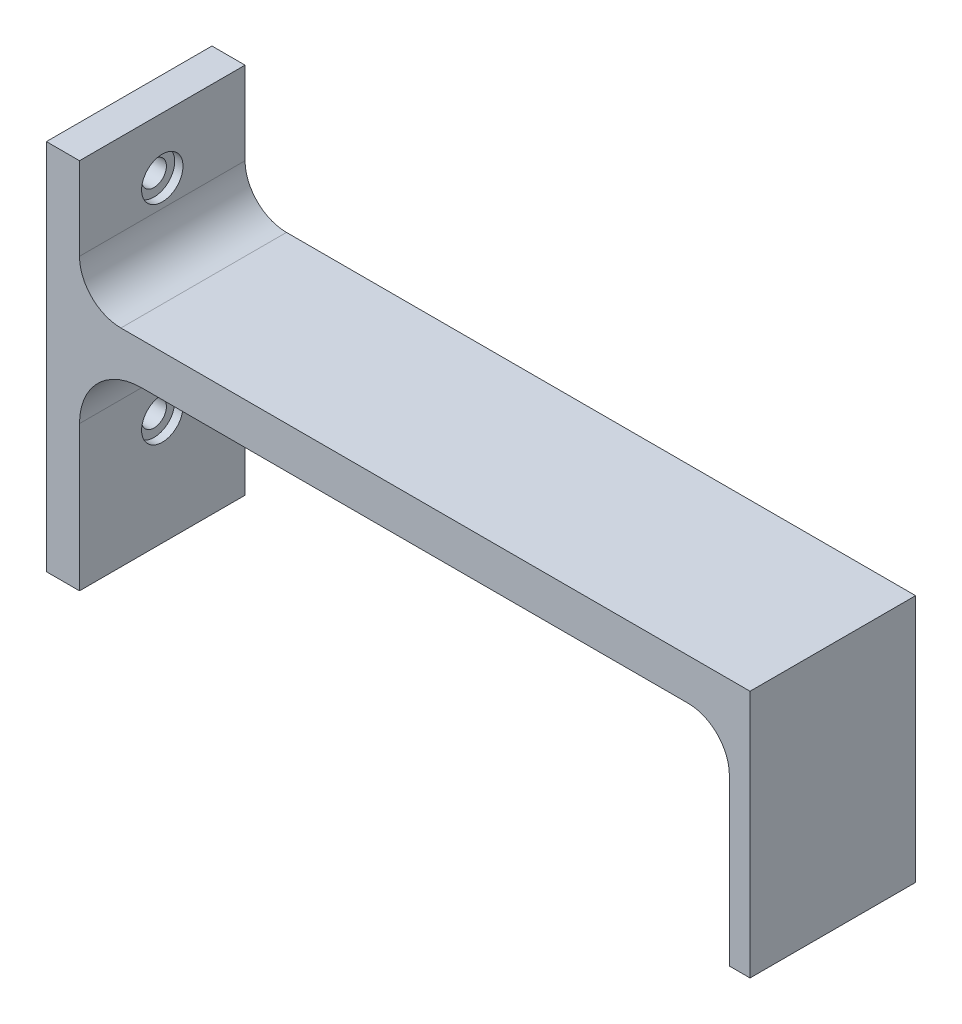
ISO-10303-21;
HEADER;
FILE_DESCRIPTION(('STEP AP214'),'2;1');
FILE_NAME('part.step','',(''),(''),'','','');
FILE_SCHEMA(('AUTOMOTIVE_DESIGN { 1 0 10303 214 1 1 1 1 }'));
ENDSEC;
DATA;
#1=APPLICATION_CONTEXT('core data for automotive mechanical design processes');
#2=APPLICATION_PROTOCOL_DEFINITION('international standard','automotive_design',2000,#1);
#3=PRODUCT_CONTEXT('',#1,'mechanical');
#4=PRODUCT('Part','Part','',(#3));
#5=PRODUCT_RELATED_PRODUCT_CATEGORY('part','',(#4));
#6=PRODUCT_DEFINITION_FORMATION('','',#4);
#7=PRODUCT_DEFINITION_CONTEXT('part definition',#1,'design');
#8=PRODUCT_DEFINITION('design','',#6,#7);
#9=PRODUCT_DEFINITION_SHAPE('','',#8);
#10=(LENGTH_UNIT() NAMED_UNIT(*) SI_UNIT(.MILLI.,.METRE.));
#11=(NAMED_UNIT(*) PLANE_ANGLE_UNIT() SI_UNIT($,.RADIAN.));
#12=(NAMED_UNIT(*) SI_UNIT($,.STERADIAN.) SOLID_ANGLE_UNIT());
#13=UNCERTAINTY_MEASURE_WITH_UNIT(LENGTH_MEASURE(1.E-05),#10,'distance_accuracy_value','');
#14=(GEOMETRIC_REPRESENTATION_CONTEXT(3) GLOBAL_UNCERTAINTY_ASSIGNED_CONTEXT((#13)) GLOBAL_UNIT_ASSIGNED_CONTEXT((#10,
#11,#12)) REPRESENTATION_CONTEXT('',''));
#15=CARTESIAN_POINT('',(0.,0.,0.));
#16=DIRECTION('',(0.,0.,1.));
#17=DIRECTION('',(1.,0.,0.));
#18=AXIS2_PLACEMENT_3D('',#15,#16,#17);
#19=CARTESIAN_POINT('',(85.001,26.3865645898633,0.));
#20=DIRECTION('',(-1.,0.,0.));
#21=DIRECTION('',(0.,0.,1.));
#22=AXIS2_PLACEMENT_3D('',#19,#20,#21);
#23=CYLINDRICAL_SURFACE('',#22,3.);
#24=CARTESIAN_POINT('',(-85.,26.3865645898633,0.));
#25=DIRECTION('',(-1.,0.,0.));
#26=DIRECTION('',(0.,0.,1.));
#27=AXIS2_PLACEMENT_3D('',#24,#25,#26);
#28=CIRCLE('',#27,3.);
#29=CARTESIAN_POINT('',(-85.,26.3865645898633,3.));
#30=VERTEX_POINT('',#29);
#31=EDGE_CURVE('E154',#30,#30,#28,.T.);
#32=ORIENTED_EDGE('',*,*,#31,.T.);
#33=EDGE_LOOP('',(#32));
#34=FACE_BOUND('',#33,.T.);
#35=CARTESIAN_POINT('',(-79.,26.3865645898633,0.));
#36=DIRECTION('',(1.,0.,0.));
#37=DIRECTION('',(0.,0.,-1.));
#38=AXIS2_PLACEMENT_3D('',#35,#36,#37);
#39=CIRCLE('',#38,3.);
#40=CARTESIAN_POINT('',(-79.,26.3865645898633,-3.));
#41=VERTEX_POINT('',#40);
#42=EDGE_CURVE('E37',#41,#41,#39,.F.);
#43=ORIENTED_EDGE('',*,*,#42,.F.);
#44=EDGE_LOOP('',(#43));
#45=FACE_BOUND('',#44,.T.);
#46=ADVANCED_FACE('F33',(#34,#45),#23,.F.);
#47=CARTESIAN_POINT('',(85.001,-23.9076754085978,0.));
#48=DIRECTION('',(-1.,0.,0.));
#49=DIRECTION('',(0.,0.,1.));
#50=AXIS2_PLACEMENT_3D('',#47,#48,#49);
#51=CYLINDRICAL_SURFACE('',#50,3.);
#52=CARTESIAN_POINT('',(-85.,-23.9076754085978,0.));
#53=DIRECTION('',(-1.,0.,0.));
#54=DIRECTION('',(0.,0.,1.));
#55=AXIS2_PLACEMENT_3D('',#52,#53,#54);
#56=CIRCLE('',#55,3.);
#57=CARTESIAN_POINT('',(-85.,-23.9076754085978,3.));
#58=VERTEX_POINT('',#57);
#59=EDGE_CURVE('E157',#58,#58,#56,.T.);
#60=ORIENTED_EDGE('',*,*,#59,.T.);
#61=EDGE_LOOP('',(#60));
#62=FACE_BOUND('',#61,.T.);
#63=CARTESIAN_POINT('',(-79.,-23.9076754085978,0.));
#64=DIRECTION('',(1.,0.,0.));
#65=DIRECTION('',(0.,0.,-1.));
#66=AXIS2_PLACEMENT_3D('',#63,#64,#65);
#67=CIRCLE('',#66,3.);
#68=CARTESIAN_POINT('',(-79.,-23.9076754085978,-3.));
#69=VERTEX_POINT('',#68);
#70=EDGE_CURVE('E234',#69,#69,#67,.F.);
#71=ORIENTED_EDGE('',*,*,#70,.F.);
#72=EDGE_LOOP('',(#71));
#73=FACE_BOUND('',#72,.T.);
#74=ADVANCED_FACE('F261',(#62,#73),#51,.F.);
#75=CARTESIAN_POINT('',(0.,0.,0.));
#76=DIRECTION('',(0.,1.,0.));
#77=DIRECTION('',(0.,0.,1.));
#78=AXIS2_PLACEMENT_3D('',#75,#76,#77);
#79=PLANE('',#78);
#80=DIRECTION('',(-1.,0.,0.));
#81=VECTOR('',#80,1.);
#82=CARTESIAN_POINT('',(-85.,0.,-20.));
#83=LINE('',#82,#81);
#84=CARTESIAN_POINT('',(70.,0.,-20.));
#85=VERTEX_POINT('',#84);
#86=CARTESIAN_POINT('',(-62.,0.,-20.));
#87=VERTEX_POINT('',#86);
#88=EDGE_CURVE('E195',#85,#87,#83,.T.);
#89=ORIENTED_EDGE('',*,*,#88,.F.);
#90=DIRECTION('',(0.,0.,-1.));
#91=VECTOR('',#90,1.);
#92=CARTESIAN_POINT('',(70.,0.,20.));
#93=LINE('',#92,#91);
#94=CARTESIAN_POINT('',(70.,0.,20.));
#95=VERTEX_POINT('',#94);
#96=EDGE_CURVE('E224',#85,#95,#93,.F.);
#97=ORIENTED_EDGE('',*,*,#96,.T.);
#98=DIRECTION('',(1.,0.,0.));
#99=VECTOR('',#98,1.);
#100=CARTESIAN_POINT('',(-85.,0.,20.));
#101=LINE('',#100,#99);
#102=CARTESIAN_POINT('',(-62.,0.,20.));
#103=VERTEX_POINT('',#102);
#104=EDGE_CURVE('E200',#103,#95,#101,.T.);
#105=ORIENTED_EDGE('',*,*,#104,.F.);
#106=DIRECTION('',(0.,0.,1.));
#107=VECTOR('',#106,1.);
#108=CARTESIAN_POINT('',(-62.,0.,-20.));
#109=LINE('',#108,#107);
#110=EDGE_CURVE('E214',#103,#87,#109,.F.);
#111=ORIENTED_EDGE('',*,*,#110,.T.);
#112=EDGE_LOOP('',(#89,#97,#105,#111));
#113=FACE_BOUND('',#112,.T.);
#114=ADVANCED_FACE('F267',(#113),#79,.F.);
#115=CARTESIAN_POINT('',(85.,10.,-20.));
#116=DIRECTION('',(-1.,0.,0.));
#117=DIRECTION('',(0.,0.,1.));
#118=AXIS2_PLACEMENT_3D('',#115,#116,#117);
#119=PLANE('',#118);
#120=DIRECTION('',(0.,-1.,0.));
#121=VECTOR('',#120,1.);
#122=CARTESIAN_POINT('',(85.,10.,20.));
#123=LINE('',#122,#121);
#124=CARTESIAN_POINT('',(85.,10.,20.));
#125=VERTEX_POINT('',#124);
#126=CARTESIAN_POINT('',(85.,-50.,20.));
#127=VERTEX_POINT('',#126);
#128=EDGE_CURVE('E139',#125,#127,#123,.T.);
#129=ORIENTED_EDGE('',*,*,#128,.T.);
#130=DIRECTION('',(0.,0.,1.));
#131=VECTOR('',#130,1.);
#132=CARTESIAN_POINT('',(85.,-50.,20.));
#133=LINE('',#132,#131);
#134=CARTESIAN_POINT('',(85.,-50.,-20.));
#135=VERTEX_POINT('',#134);
#136=EDGE_CURVE('E166',#135,#127,#133,.T.);
#137=ORIENTED_EDGE('',*,*,#136,.F.);
#138=DIRECTION('',(0.,-1.,0.));
#139=VECTOR('',#138,1.);
#140=CARTESIAN_POINT('',(85.,10.,-20.));
#141=LINE('',#140,#139);
#142=CARTESIAN_POINT('',(85.,10.,-20.));
#143=VERTEX_POINT('',#142);
#144=EDGE_CURVE('E209',#143,#135,#141,.T.);
#145=ORIENTED_EDGE('',*,*,#144,.F.);
#146=DIRECTION('',(0.,0.,-1.));
#147=VECTOR('',#146,1.);
#148=CARTESIAN_POINT('',(85.,10.,-20.));
#149=LINE('',#148,#147);
#150=EDGE_CURVE('E196',#125,#143,#149,.T.);
#151=ORIENTED_EDGE('',*,*,#150,.F.);
#152=EDGE_LOOP('',(#129,#137,#145,#151));
#153=FACE_BOUND('',#152,.T.);
#154=ADVANCED_FACE('F301',(#153),#119,.F.);
#155=CARTESIAN_POINT('',(-85.,10.,-20.));
#156=DIRECTION('',(0.,0.,1.));
#157=DIRECTION('',(1.,0.,0.));
#158=AXIS2_PLACEMENT_3D('',#155,#156,#157);
#159=PLANE('',#158);
#160=ORIENTED_EDGE('',*,*,#144,.T.);
#161=DIRECTION('',(1.,0.,0.));
#162=VECTOR('',#161,1.);
#163=CARTESIAN_POINT('',(85.,-50.,-20.));
#164=LINE('',#163,#162);
#165=CARTESIAN_POINT('',(80.,-50.,-20.));
#166=VERTEX_POINT('',#165);
#167=EDGE_CURVE('E173',#166,#135,#164,.T.);
#168=ORIENTED_EDGE('',*,*,#167,.F.);
#169=DIRECTION('',(0.,1.,0.));
#170=VECTOR('',#169,1.);
#171=CARTESIAN_POINT('',(80.,-50.,-20.));
#172=LINE('',#171,#170);
#173=CARTESIAN_POINT('',(80.,-10.,-20.));
#174=VERTEX_POINT('',#173);
#175=EDGE_CURVE('E176',#166,#174,#172,.T.);
#176=ORIENTED_EDGE('',*,*,#175,.T.);
#177=CARTESIAN_POINT('',(70.,-10.,-20.));
#178=DIRECTION('',(0.,0.,1.));
#179=DIRECTION('',(1.,0.,0.));
#180=AXIS2_PLACEMENT_3D('',#177,#178,#179);
#181=CIRCLE('',#180,10.);
#182=EDGE_CURVE('E226',#174,#85,#181,.T.);
#183=ORIENTED_EDGE('',*,*,#182,.T.);
#184=ORIENTED_EDGE('',*,*,#88,.T.);
#185=CARTESIAN_POINT('',(-62.,-15.,-20.));
#186=DIRECTION('',(0.,0.,1.));
#187=DIRECTION('',(1.,0.,0.));
#188=AXIS2_PLACEMENT_3D('',#185,#186,#187);
#189=CIRCLE('',#188,15.);
#190=CARTESIAN_POINT('',(-77.,-15.,-20.));
#191=VERTEX_POINT('',#190);
#192=EDGE_CURVE('E219',#87,#191,#189,.T.);
#193=ORIENTED_EDGE('',*,*,#192,.T.);
#194=DIRECTION('',(0.,1.,0.));
#195=VECTOR('',#194,1.);
#196=CARTESIAN_POINT('',(-77.,-50.,-20.));
#197=LINE('',#196,#195);
#198=CARTESIAN_POINT('',(-77.,-50.,-20.));
#199=VERTEX_POINT('',#198);
#200=EDGE_CURVE('E192',#199,#191,#197,.T.);
#201=ORIENTED_EDGE('',*,*,#200,.F.);
#202=DIRECTION('',(1.,0.,0.));
#203=VECTOR('',#202,1.);
#204=CARTESIAN_POINT('',(-85.,-50.,-20.));
#205=LINE('',#204,#203);
#206=CARTESIAN_POINT('',(-85.,-50.,-20.));
#207=VERTEX_POINT('',#206);
#208=EDGE_CURVE('E183',#207,#199,#205,.T.);
#209=ORIENTED_EDGE('',*,*,#208,.F.);
#210=DIRECTION('',(0.,-1.,0.));
#211=VECTOR('',#210,1.);
#212=CARTESIAN_POINT('',(-85.,10.,-20.));
#213=LINE('',#212,#211);
#214=CARTESIAN_POINT('',(-85.,40.,-20.));
#215=VERTEX_POINT('',#214);
#216=EDGE_CURVE('E138',#215,#207,#213,.T.);
#217=ORIENTED_EDGE('',*,*,#216,.F.);
#218=DIRECTION('',(-1.,0.,0.));
#219=VECTOR('',#218,1.);
#220=CARTESIAN_POINT('',(-85.,40.,-20.));
#221=LINE('',#220,#219);
#222=CARTESIAN_POINT('',(-77.,40.,-20.));
#223=VERTEX_POINT('',#222);
#224=EDGE_CURVE('E153',#223,#215,#221,.T.);
#225=ORIENTED_EDGE('',*,*,#224,.F.);
#226=DIRECTION('',(0.,-1.,0.));
#227=VECTOR('',#226,1.);
#228=CARTESIAN_POINT('',(-77.,40.,-20.));
#229=LINE('',#228,#227);
#230=CARTESIAN_POINT('',(-77.,20.,-20.));
#231=VERTEX_POINT('',#230);
#232=EDGE_CURVE('E163',#223,#231,#229,.T.);
#233=ORIENTED_EDGE('',*,*,#232,.T.);
#234=CARTESIAN_POINT('',(-67.,20.,-20.));
#235=DIRECTION('',(0.,0.,1.));
#236=DIRECTION('',(1.,0.,0.));
#237=AXIS2_PLACEMENT_3D('',#234,#235,#236);
#238=CIRCLE('',#237,10.);
#239=CARTESIAN_POINT('',(-67.,10.,-20.));
#240=VERTEX_POINT('',#239);
#241=EDGE_CURVE('E42',#231,#240,#238,.T.);
#242=ORIENTED_EDGE('',*,*,#241,.T.);
#243=DIRECTION('',(-1.,0.,0.));
#244=VECTOR('',#243,1.);
#245=CARTESIAN_POINT('',(-85.,10.,-20.));
#246=LINE('',#245,#244);
#247=EDGE_CURVE('E199',#143,#240,#246,.T.);
#248=ORIENTED_EDGE('',*,*,#247,.F.);
#249=EDGE_LOOP('',(#160,#168,#176,#183,#184,#193,#201,#209,#217,#225,#233,#242,#248));
#250=FACE_BOUND('',#249,.T.);
#251=ADVANCED_FACE('F307',(#250),#159,.F.);
#252=CARTESIAN_POINT('',(-85.,10.,-20.));
#253=DIRECTION('',(1.,0.,0.));
#254=DIRECTION('',(0.,0.,-1.));
#255=AXIS2_PLACEMENT_3D('',#252,#253,#254);
#256=PLANE('',#255);
#257=ORIENTED_EDGE('',*,*,#59,.F.);
#258=EDGE_LOOP('',(#257));
#259=FACE_BOUND('',#258,.T.);
#260=ORIENTED_EDGE('',*,*,#31,.F.);
#261=EDGE_LOOP('',(#260));
#262=FACE_BOUND('',#261,.T.);
#263=ORIENTED_EDGE('',*,*,#216,.T.);
#264=DIRECTION('',(0.,0.,-1.));
#265=VECTOR('',#264,1.);
#266=CARTESIAN_POINT('',(-85.,-50.,20.));
#267=LINE('',#266,#265);
#268=CARTESIAN_POINT('',(-85.,-50.,20.));
#269=VERTEX_POINT('',#268);
#270=EDGE_CURVE('E134',#269,#207,#267,.T.);
#271=ORIENTED_EDGE('',*,*,#270,.F.);
#272=DIRECTION('',(0.,-1.,0.));
#273=VECTOR('',#272,1.);
#274=CARTESIAN_POINT('',(-85.,10.,20.));
#275=LINE('',#274,#273);
#276=CARTESIAN_POINT('',(-85.,40.,20.));
#277=VERTEX_POINT('',#276);
#278=EDGE_CURVE('E128',#277,#269,#275,.T.);
#279=ORIENTED_EDGE('',*,*,#278,.F.);
#280=DIRECTION('',(0.,0.,1.));
#281=VECTOR('',#280,1.);
#282=CARTESIAN_POINT('',(-85.,40.,20.));
#283=LINE('',#282,#281);
#284=EDGE_CURVE('E132',#215,#277,#283,.T.);
#285=ORIENTED_EDGE('',*,*,#284,.F.);
#286=EDGE_LOOP('',(#263,#271,#279,#285));
#287=FACE_BOUND('',#286,.T.);
#288=ADVANCED_FACE('F130',(#259,#262,#287),#256,.F.);
#289=CARTESIAN_POINT('',(-85.,10.,20.));
#290=DIRECTION('',(0.,0.,-1.));
#291=DIRECTION('',(-1.,0.,0.));
#292=AXIS2_PLACEMENT_3D('',#289,#290,#291);
#293=PLANE('',#292);
#294=ORIENTED_EDGE('',*,*,#278,.T.);
#295=DIRECTION('',(-1.,0.,0.));
#296=VECTOR('',#295,1.);
#297=CARTESIAN_POINT('',(-85.,-50.,20.));
#298=LINE('',#297,#296);
#299=CARTESIAN_POINT('',(-77.,-50.,20.));
#300=VERTEX_POINT('',#299);
#301=EDGE_CURVE('E187',#300,#269,#298,.T.);
#302=ORIENTED_EDGE('',*,*,#301,.F.);
#303=DIRECTION('',(0.,1.,0.));
#304=VECTOR('',#303,1.);
#305=CARTESIAN_POINT('',(-77.,-50.,20.));
#306=LINE('',#305,#304);
#307=CARTESIAN_POINT('',(-77.,-15.,20.));
#308=VERTEX_POINT('',#307);
#309=EDGE_CURVE('E189',#300,#308,#306,.T.);
#310=ORIENTED_EDGE('',*,*,#309,.T.);
#311=CARTESIAN_POINT('',(-62.,-15.,20.));
#312=DIRECTION('',(0.,0.,-1.));
#313=DIRECTION('',(-1.,0.,0.));
#314=AXIS2_PLACEMENT_3D('',#311,#312,#313);
#315=CIRCLE('',#314,15.);
#316=EDGE_CURVE('E217',#308,#103,#315,.T.);
#317=ORIENTED_EDGE('',*,*,#316,.T.);
#318=ORIENTED_EDGE('',*,*,#104,.T.);
#319=CARTESIAN_POINT('',(70.,-10.,20.));
#320=DIRECTION('',(0.,0.,-1.));
#321=DIRECTION('',(-1.,0.,0.));
#322=AXIS2_PLACEMENT_3D('',#319,#320,#321);
#323=CIRCLE('',#322,10.);
#324=CARTESIAN_POINT('',(80.,-10.,20.));
#325=VERTEX_POINT('',#324);
#326=EDGE_CURVE('E228',#95,#325,#323,.T.);
#327=ORIENTED_EDGE('',*,*,#326,.T.);
#328=DIRECTION('',(0.,1.,0.));
#329=VECTOR('',#328,1.);
#330=CARTESIAN_POINT('',(80.,-50.,20.));
#331=LINE('',#330,#329);
#332=CARTESIAN_POINT('',(80.,-50.,20.));
#333=VERTEX_POINT('',#332);
#334=EDGE_CURVE('E179',#333,#325,#331,.T.);
#335=ORIENTED_EDGE('',*,*,#334,.F.);
#336=DIRECTION('',(-1.,0.,0.));
#337=VECTOR('',#336,1.);
#338=CARTESIAN_POINT('',(85.,-50.,20.));
#339=LINE('',#338,#337);
#340=EDGE_CURVE('E169',#127,#333,#339,.T.);
#341=ORIENTED_EDGE('',*,*,#340,.F.);
#342=ORIENTED_EDGE('',*,*,#128,.F.);
#343=DIRECTION('',(1.,0.,0.));
#344=VECTOR('',#343,1.);
#345=CARTESIAN_POINT('',(-85.,10.,20.));
#346=LINE('',#345,#344);
#347=CARTESIAN_POINT('',(-67.,10.,20.));
#348=VERTEX_POINT('',#347);
#349=EDGE_CURVE('E202',#348,#125,#346,.T.);
#350=ORIENTED_EDGE('',*,*,#349,.F.);
#351=CARTESIAN_POINT('',(-67.,20.,20.));
#352=DIRECTION('',(0.,0.,-1.));
#353=DIRECTION('',(-1.,0.,0.));
#354=AXIS2_PLACEMENT_3D('',#351,#352,#353);
#355=CIRCLE('',#354,10.);
#356=CARTESIAN_POINT('',(-77.,20.,20.));
#357=VERTEX_POINT('',#356);
#358=EDGE_CURVE('E11',#348,#357,#355,.T.);
#359=ORIENTED_EDGE('',*,*,#358,.T.);
#360=DIRECTION('',(0.,-1.,0.));
#361=VECTOR('',#360,1.);
#362=CARTESIAN_POINT('',(-77.,40.,20.));
#363=LINE('',#362,#361);
#364=CARTESIAN_POINT('',(-77.,40.,20.));
#365=VERTEX_POINT('',#364);
#366=EDGE_CURVE('E145',#365,#357,#363,.T.);
#367=ORIENTED_EDGE('',*,*,#366,.F.);
#368=DIRECTION('',(1.,0.,0.));
#369=VECTOR('',#368,1.);
#370=CARTESIAN_POINT('',(-85.,40.,20.));
#371=LINE('',#370,#369);
#372=EDGE_CURVE('E142',#277,#365,#371,.T.);
#373=ORIENTED_EDGE('',*,*,#372,.F.);
#374=EDGE_LOOP('',(#294,#302,#310,#317,#318,#327,#335,#341,#342,#350,#359,#367,#373));
#375=FACE_BOUND('',#374,.T.);
#376=ADVANCED_FACE('F143',(#375),#293,.F.);
#377=CARTESIAN_POINT('',(0.,10.,0.));
#378=DIRECTION('',(0.,1.,0.));
#379=DIRECTION('',(0.,0.,1.));
#380=AXIS2_PLACEMENT_3D('',#377,#378,#379);
#381=PLANE('',#380);
#382=ORIENTED_EDGE('',*,*,#247,.T.);
#383=DIRECTION('',(0.,0.,-1.));
#384=VECTOR('',#383,1.);
#385=CARTESIAN_POINT('',(-67.,10.,0.));
#386=LINE('',#385,#384);
#387=EDGE_CURVE('E56',#240,#348,#386,.F.);
#388=ORIENTED_EDGE('',*,*,#387,.T.);
#389=ORIENTED_EDGE('',*,*,#349,.T.);
#390=ORIENTED_EDGE('',*,*,#150,.T.);
#391=EDGE_LOOP('',(#382,#388,#389,#390));
#392=FACE_BOUND('',#391,.T.);
#393=ADVANCED_FACE('F295',(#392),#381,.T.);
#394=CARTESIAN_POINT('',(-77.,-50.,20.));
#395=DIRECTION('',(-1.,0.,0.));
#396=DIRECTION('',(0.,0.,1.));
#397=AXIS2_PLACEMENT_3D('',#394,#395,#396);
#398=PLANE('',#397);
#399=CARTESIAN_POINT('',(-77.,-23.9076754085978,0.));
#400=DIRECTION('',(1.,0.,0.));
#401=DIRECTION('',(0.,0.,-1.));
#402=AXIS2_PLACEMENT_3D('',#399,#400,#401);
#403=CIRCLE('',#402,5.);
#404=CARTESIAN_POINT('',(-77.,-23.9076754085978,-4.99999999999997));
#405=VERTEX_POINT('',#404);
#406=EDGE_CURVE('E241',#405,#405,#403,.T.);
#407=ORIENTED_EDGE('',*,*,#406,.F.);
#408=EDGE_LOOP('',(#407));
#409=FACE_BOUND('',#408,.T.);
#410=ORIENTED_EDGE('',*,*,#200,.T.);
#411=DIRECTION('',(0.,0.,1.));
#412=VECTOR('',#411,1.);
#413=CARTESIAN_POINT('',(-77.,-15.,20.));
#414=LINE('',#413,#412);
#415=EDGE_CURVE('E211',#191,#308,#414,.T.);
#416=ORIENTED_EDGE('',*,*,#415,.T.);
#417=ORIENTED_EDGE('',*,*,#309,.F.);
#418=DIRECTION('',(0.,0.,1.));
#419=VECTOR('',#418,1.);
#420=CARTESIAN_POINT('',(-77.,-50.,20.));
#421=LINE('',#420,#419);
#422=EDGE_CURVE('E185',#199,#300,#421,.T.);
#423=ORIENTED_EDGE('',*,*,#422,.F.);
#424=EDGE_LOOP('',(#410,#416,#417,#423));
#425=FACE_BOUND('',#424,.T.);
#426=ADVANCED_FACE('F291',(#409,#425),#398,.F.);
#427=CARTESIAN_POINT('',(0.,-50.,0.));
#428=DIRECTION('',(0.,-1.,0.));
#429=DIRECTION('',(0.,0.,-1.));
#430=AXIS2_PLACEMENT_3D('',#427,#428,#429);
#431=PLANE('',#430);
#432=ORIENTED_EDGE('',*,*,#270,.T.);
#433=ORIENTED_EDGE('',*,*,#208,.T.);
#434=ORIENTED_EDGE('',*,*,#422,.T.);
#435=ORIENTED_EDGE('',*,*,#301,.T.);
#436=EDGE_LOOP('',(#432,#433,#434,#435));
#437=FACE_BOUND('',#436,.T.);
#438=ADVANCED_FACE('F287',(#437),#431,.T.);
#439=CARTESIAN_POINT('',(80.,-50.,20.));
#440=DIRECTION('',(1.,0.,0.));
#441=DIRECTION('',(0.,0.,-1.));
#442=AXIS2_PLACEMENT_3D('',#439,#440,#441);
#443=PLANE('',#442);
#444=ORIENTED_EDGE('',*,*,#334,.T.);
#445=DIRECTION('',(0.,0.,-1.));
#446=VECTOR('',#445,1.);
#447=CARTESIAN_POINT('',(80.,-10.,-20.));
#448=LINE('',#447,#446);
#449=EDGE_CURVE('E221',#325,#174,#448,.T.);
#450=ORIENTED_EDGE('',*,*,#449,.T.);
#451=ORIENTED_EDGE('',*,*,#175,.F.);
#452=DIRECTION('',(0.,0.,-1.));
#453=VECTOR('',#452,1.);
#454=CARTESIAN_POINT('',(80.,-50.,20.));
#455=LINE('',#454,#453);
#456=EDGE_CURVE('E171',#333,#166,#455,.T.);
#457=ORIENTED_EDGE('',*,*,#456,.F.);
#458=EDGE_LOOP('',(#444,#450,#451,#457));
#459=FACE_BOUND('',#458,.T.);
#460=ADVANCED_FACE('F283',(#459),#443,.F.);
#461=CARTESIAN_POINT('',(0.,-50.,0.));
#462=DIRECTION('',(0.,1.,0.));
#463=DIRECTION('',(0.,0.,1.));
#464=AXIS2_PLACEMENT_3D('',#461,#462,#463);
#465=PLANE('',#464);
#466=ORIENTED_EDGE('',*,*,#136,.T.);
#467=ORIENTED_EDGE('',*,*,#340,.T.);
#468=ORIENTED_EDGE('',*,*,#456,.T.);
#469=ORIENTED_EDGE('',*,*,#167,.T.);
#470=EDGE_LOOP('',(#466,#467,#468,#469));
#471=FACE_BOUND('',#470,.T.);
#472=ADVANCED_FACE('F279',(#471),#465,.F.);
#473=CARTESIAN_POINT('',(-62.,-15.,20.));
#474=DIRECTION('',(0.,0.,-1.));
#475=DIRECTION('',(-1.,0.,0.));
#476=AXIS2_PLACEMENT_3D('',#473,#474,#475);
#477=CYLINDRICAL_SURFACE('',#476,15.);
#478=ORIENTED_EDGE('',*,*,#192,.F.);
#479=ORIENTED_EDGE('',*,*,#110,.F.);
#480=ORIENTED_EDGE('',*,*,#316,.F.);
#481=ORIENTED_EDGE('',*,*,#415,.F.);
#482=EDGE_LOOP('',(#478,#479,#480,#481));
#483=FACE_BOUND('',#482,.T.);
#484=ADVANCED_FACE('F282',(#483),#477,.F.);
#485=CARTESIAN_POINT('',(70.,-10.,20.));
#486=DIRECTION('',(0.,0.,1.));
#487=DIRECTION('',(1.,0.,0.));
#488=AXIS2_PLACEMENT_3D('',#485,#486,#487);
#489=CYLINDRICAL_SURFACE('',#488,10.);
#490=ORIENTED_EDGE('',*,*,#326,.F.);
#491=ORIENTED_EDGE('',*,*,#96,.F.);
#492=ORIENTED_EDGE('',*,*,#182,.F.);
#493=ORIENTED_EDGE('',*,*,#449,.F.);
#494=EDGE_LOOP('',(#490,#491,#492,#493));
#495=FACE_BOUND('',#494,.T.);
#496=ADVANCED_FACE('F277',(#495),#489,.F.);
#497=CARTESIAN_POINT('',(-77.,40.,20.));
#498=DIRECTION('',(-1.,0.,0.));
#499=DIRECTION('',(0.,0.,1.));
#500=AXIS2_PLACEMENT_3D('',#497,#498,#499);
#501=PLANE('',#500);
#502=CARTESIAN_POINT('',(-77.,26.3865645898633,0.));
#503=DIRECTION('',(1.,0.,0.));
#504=DIRECTION('',(0.,0.,-1.));
#505=AXIS2_PLACEMENT_3D('',#502,#503,#504);
#506=CIRCLE('',#505,5.);
#507=CARTESIAN_POINT('',(-77.,26.3865645898633,-5.));
#508=VERTEX_POINT('',#507);
#509=EDGE_CURVE('E248',#508,#508,#506,.T.);
#510=ORIENTED_EDGE('',*,*,#509,.F.);
#511=EDGE_LOOP('',(#510));
#512=FACE_BOUND('',#511,.T.);
#513=ORIENTED_EDGE('',*,*,#366,.T.);
#514=DIRECTION('',(0.,0.,-1.));
#515=VECTOR('',#514,1.);
#516=CARTESIAN_POINT('',(-77.,20.,20.));
#517=LINE('',#516,#515);
#518=EDGE_CURVE('E230',#357,#231,#517,.T.);
#519=ORIENTED_EDGE('',*,*,#518,.T.);
#520=ORIENTED_EDGE('',*,*,#232,.F.);
#521=DIRECTION('',(0.,0.,-1.));
#522=VECTOR('',#521,1.);
#523=CARTESIAN_POINT('',(-77.,40.,20.));
#524=LINE('',#523,#522);
#525=EDGE_CURVE('E148',#365,#223,#524,.T.);
#526=ORIENTED_EDGE('',*,*,#525,.F.);
#527=EDGE_LOOP('',(#513,#519,#520,#526));
#528=FACE_BOUND('',#527,.T.);
#529=ADVANCED_FACE('F274',(#512,#528),#501,.F.);
#530=CARTESIAN_POINT('',(0.,40.,0.));
#531=DIRECTION('',(0.,-1.,0.));
#532=DIRECTION('',(0.,0.,-1.));
#533=AXIS2_PLACEMENT_3D('',#530,#531,#532);
#534=PLANE('',#533);
#535=ORIENTED_EDGE('',*,*,#284,.T.);
#536=ORIENTED_EDGE('',*,*,#372,.T.);
#537=ORIENTED_EDGE('',*,*,#525,.T.);
#538=ORIENTED_EDGE('',*,*,#224,.T.);
#539=EDGE_LOOP('',(#535,#536,#537,#538));
#540=FACE_BOUND('',#539,.T.);
#541=ADVANCED_FACE('F151',(#540),#534,.F.);
#542=CARTESIAN_POINT('',(-67.,20.,20.));
#543=DIRECTION('',(0.,0.,-1.));
#544=DIRECTION('',(-1.,0.,0.));
#545=AXIS2_PLACEMENT_3D('',#542,#543,#544);
#546=CYLINDRICAL_SURFACE('',#545,10.);
#547=ORIENTED_EDGE('',*,*,#358,.F.);
#548=ORIENTED_EDGE('',*,*,#387,.F.);
#549=ORIENTED_EDGE('',*,*,#241,.F.);
#550=ORIENTED_EDGE('',*,*,#518,.F.);
#551=EDGE_LOOP('',(#547,#548,#549,#550));
#552=FACE_BOUND('',#551,.T.);
#553=ADVANCED_FACE('F35',(#552),#546,.F.);
#554=CARTESIAN_POINT('',(-79.,-23.9076754085978,0.));
#555=DIRECTION('',(1.,0.,0.));
#556=DIRECTION('',(0.,0.,-1.));
#557=AXIS2_PLACEMENT_3D('',#554,#555,#556);
#558=PLANE('',#557);
#559=CARTESIAN_POINT('',(-79.,-23.9076754085978,0.));
#560=DIRECTION('',(1.,0.,0.));
#561=DIRECTION('',(0.,0.,-1.));
#562=AXIS2_PLACEMENT_3D('',#559,#560,#561);
#563=CIRCLE('',#562,5.);
#564=CARTESIAN_POINT('',(-79.,-23.9076754085978,-4.99999999999997));
#565=VERTEX_POINT('',#564);
#566=EDGE_CURVE('E236',#565,#565,#563,.T.);
#567=ORIENTED_EDGE('',*,*,#566,.T.);
#568=EDGE_LOOP('',(#567));
#569=FACE_BOUND('',#568,.T.);
#570=ORIENTED_EDGE('',*,*,#70,.T.);
#571=EDGE_LOOP('',(#570));
#572=FACE_BOUND('',#571,.T.);
#573=ADVANCED_FACE('F348',(#569,#572),#558,.T.);
#574=CARTESIAN_POINT('',(-79.,-23.9076754085978,0.));
#575=DIRECTION('',(1.,0.,0.));
#576=DIRECTION('',(0.,0.,-1.));
#577=AXIS2_PLACEMENT_3D('',#574,#575,#576);
#578=CYLINDRICAL_SURFACE('',#577,5.);
#579=ORIENTED_EDGE('',*,*,#566,.F.);
#580=EDGE_LOOP('',(#579));
#581=FACE_BOUND('',#580,.T.);
#582=ORIENTED_EDGE('',*,*,#406,.T.);
#583=EDGE_LOOP('',(#582));
#584=FACE_BOUND('',#583,.T.);
#585=ADVANCED_FACE('F352',(#581,#584),#578,.F.);
#586=CARTESIAN_POINT('',(-79.,26.3865645898633,0.));
#587=DIRECTION('',(1.,0.,0.));
#588=DIRECTION('',(0.,0.,-1.));
#589=AXIS2_PLACEMENT_3D('',#586,#587,#588);
#590=PLANE('',#589);
#591=CARTESIAN_POINT('',(-79.,26.3865645898633,0.));
#592=DIRECTION('',(1.,0.,0.));
#593=DIRECTION('',(0.,0.,-1.));
#594=AXIS2_PLACEMENT_3D('',#591,#592,#593);
#595=CIRCLE('',#594,5.);
#596=CARTESIAN_POINT('',(-79.,26.3865645898633,-5.));
#597=VERTEX_POINT('',#596);
#598=EDGE_CURVE('E251',#597,#597,#595,.T.);
#599=ORIENTED_EDGE('',*,*,#598,.T.);
#600=EDGE_LOOP('',(#599));
#601=FACE_BOUND('',#600,.T.);
#602=ORIENTED_EDGE('',*,*,#42,.T.);
#603=EDGE_LOOP('',(#602));
#604=FACE_BOUND('',#603,.T.);
#605=ADVANCED_FACE('F258',(#601,#604),#590,.T.);
#606=CARTESIAN_POINT('',(-79.,26.3865645898633,0.));
#607=DIRECTION('',(1.,0.,0.));
#608=DIRECTION('',(0.,0.,-1.));
#609=AXIS2_PLACEMENT_3D('',#606,#607,#608);
#610=CYLINDRICAL_SURFACE('',#609,5.);
#611=ORIENTED_EDGE('',*,*,#598,.F.);
#612=EDGE_LOOP('',(#611));
#613=FACE_BOUND('',#612,.T.);
#614=ORIENTED_EDGE('',*,*,#509,.T.);
#615=EDGE_LOOP('',(#614));
#616=FACE_BOUND('',#615,.T.);
#617=ADVANCED_FACE('F359',(#613,#616),#610,.F.);
#618=CLOSED_SHELL('',(#46,#74,#114,#154,#251,#288,#376,#393,#426,#438,#460,#472,#484,#496,#529,
#541,#553,#573,#585,#605,#617));
#619=MANIFOLD_SOLID_BREP('B2',#618);
#620=ADVANCED_BREP_SHAPE_REPRESENTATION('',(#18,#619),#14);
#621=SHAPE_DEFINITION_REPRESENTATION(#9,#620);
ENDSEC;
END-ISO-10303-21;
